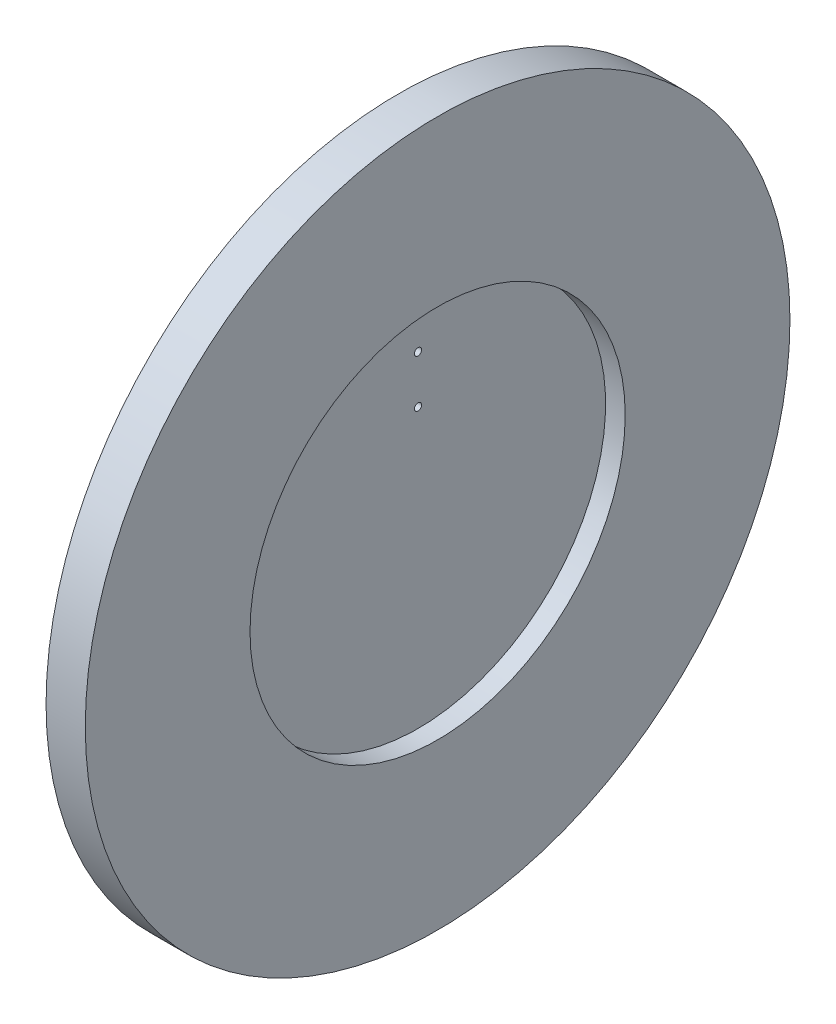
ISO-10303-21;
HEADER;
FILE_DESCRIPTION(('STEP AP214'),'2;1');
FILE_NAME('part.step','',(''),(''),'','','');
FILE_SCHEMA(('AUTOMOTIVE_DESIGN { 1 0 10303 214 1 1 1 1 }'));
ENDSEC;
DATA;
#1=APPLICATION_CONTEXT('core data for automotive mechanical design processes');
#2=APPLICATION_PROTOCOL_DEFINITION('international standard','automotive_design',2000,#1);
#3=PRODUCT_CONTEXT('',#1,'mechanical');
#4=PRODUCT('Part','Part','',(#3));
#5=PRODUCT_RELATED_PRODUCT_CATEGORY('part','',(#4));
#6=PRODUCT_DEFINITION_FORMATION('','',#4);
#7=PRODUCT_DEFINITION_CONTEXT('part definition',#1,'design');
#8=PRODUCT_DEFINITION('design','',#6,#7);
#9=PRODUCT_DEFINITION_SHAPE('','',#8);
#10=(LENGTH_UNIT() NAMED_UNIT(*) SI_UNIT(.MILLI.,.METRE.));
#11=(NAMED_UNIT(*) PLANE_ANGLE_UNIT() SI_UNIT($,.RADIAN.));
#12=(NAMED_UNIT(*) SI_UNIT($,.STERADIAN.) SOLID_ANGLE_UNIT());
#13=UNCERTAINTY_MEASURE_WITH_UNIT(LENGTH_MEASURE(1.E-05),#10,'distance_accuracy_value','');
#14=(GEOMETRIC_REPRESENTATION_CONTEXT(3) GLOBAL_UNCERTAINTY_ASSIGNED_CONTEXT((#13)) GLOBAL_UNIT_ASSIGNED_CONTEXT((#10,
#11,#12)) REPRESENTATION_CONTEXT('',''));
#15=CARTESIAN_POINT('',(0.,0.,0.));
#16=DIRECTION('',(0.,0.,1.));
#17=DIRECTION('',(1.,0.,0.));
#18=AXIS2_PLACEMENT_3D('',#15,#16,#17);
#19=CARTESIAN_POINT('',(10.,0.,0.));
#20=DIRECTION('',(-1.,0.,0.));
#21=DIRECTION('',(0.,0.,1.));
#22=AXIS2_PLACEMENT_3D('',#19,#20,#21);
#23=CYLINDRICAL_SURFACE('',#22,47.825);
#24=CARTESIAN_POINT('',(10.,0.,0.));
#25=DIRECTION('',(1.,0.,0.));
#26=DIRECTION('',(0.,0.,-1.));
#27=AXIS2_PLACEMENT_3D('',#24,#25,#26);
#28=CIRCLE('',#27,47.825);
#29=CARTESIAN_POINT('',(10.,0.,-47.825));
#30=VERTEX_POINT('',#29);
#31=EDGE_CURVE('E61',#30,#30,#28,.T.);
#32=ORIENTED_EDGE('',*,*,#31,.T.);
#33=EDGE_LOOP('',(#32));
#34=FACE_BOUND('',#33,.T.);
#35=CARTESIAN_POINT('',(5.,0.,0.));
#36=DIRECTION('',(-1.,0.,0.));
#37=DIRECTION('',(0.,0.,1.));
#38=AXIS2_PLACEMENT_3D('',#35,#36,#37);
#39=CIRCLE('',#38,47.825);
#40=CARTESIAN_POINT('',(5.,0.,47.825));
#41=VERTEX_POINT('',#40);
#42=EDGE_CURVE('E58',#41,#41,#39,.T.);
#43=ORIENTED_EDGE('',*,*,#42,.T.);
#44=EDGE_LOOP('',(#43));
#45=FACE_BOUND('',#44,.T.);
#46=ADVANCED_FACE('F41',(#34,#45),#23,.F.);
#47=CARTESIAN_POINT('',(10.,0.,0.));
#48=DIRECTION('',(1.,0.,0.));
#49=DIRECTION('',(0.,0.,-1.));
#50=AXIS2_PLACEMENT_3D('',#47,#48,#49);
#51=PLANE('',#50);
#52=CARTESIAN_POINT('',(10.,0.,0.));
#53=DIRECTION('',(1.,0.,0.));
#54=DIRECTION('',(0.,0.,-1.));
#55=AXIS2_PLACEMENT_3D('',#52,#53,#54);
#56=CIRCLE('',#55,89.825);
#57=CARTESIAN_POINT('',(10.,0.,-89.825));
#58=VERTEX_POINT('',#57);
#59=EDGE_CURVE('E49',#58,#58,#56,.T.);
#60=ORIENTED_EDGE('',*,*,#59,.T.);
#61=EDGE_LOOP('',(#60));
#62=FACE_BOUND('',#61,.T.);
#63=ORIENTED_EDGE('',*,*,#31,.F.);
#64=EDGE_LOOP('',(#63));
#65=FACE_BOUND('',#64,.T.);
#66=ADVANCED_FACE('F71',(#62,#65),#51,.T.);
#67=CARTESIAN_POINT('',(0.,0.,0.));
#68=DIRECTION('',(1.,0.,0.));
#69=DIRECTION('',(0.,0.,-1.));
#70=AXIS2_PLACEMENT_3D('',#67,#68,#69);
#71=PLANE('',#70);
#72=CARTESIAN_POINT('',(0.,0.,0.));
#73=DIRECTION('',(-1.,0.,0.));
#74=DIRECTION('',(0.,0.,1.));
#75=AXIS2_PLACEMENT_3D('',#72,#73,#74);
#76=CIRCLE('',#75,47.825);
#77=CARTESIAN_POINT('',(0.,0.,47.825));
#78=VERTEX_POINT('',#77);
#79=EDGE_CURVE('E10',#78,#78,#76,.T.);
#80=ORIENTED_EDGE('',*,*,#79,.F.);
#81=EDGE_LOOP('',(#80));
#82=FACE_BOUND('',#81,.T.);
#83=CARTESIAN_POINT('',(0.,0.,0.));
#84=DIRECTION('',(1.,0.,0.));
#85=DIRECTION('',(0.,0.,-1.));
#86=AXIS2_PLACEMENT_3D('',#83,#84,#85);
#87=CIRCLE('',#86,89.825);
#88=CARTESIAN_POINT('',(0.,0.,-89.825));
#89=VERTEX_POINT('',#88);
#90=EDGE_CURVE('E45',#89,#89,#87,.T.);
#91=ORIENTED_EDGE('',*,*,#90,.F.);
#92=EDGE_LOOP('',(#91));
#93=FACE_BOUND('',#92,.T.);
#94=ADVANCED_FACE('F69',(#82,#93),#71,.F.);
#95=CARTESIAN_POINT('',(10.,0.,0.));
#96=DIRECTION('',(-1.,0.,0.));
#97=DIRECTION('',(0.,0.,1.));
#98=AXIS2_PLACEMENT_3D('',#95,#96,#97);
#99=CYLINDRICAL_SURFACE('',#98,89.825);
#100=ORIENTED_EDGE('',*,*,#59,.F.);
#101=EDGE_LOOP('',(#100));
#102=FACE_BOUND('',#101,.T.);
#103=ORIENTED_EDGE('',*,*,#90,.T.);
#104=EDGE_LOOP('',(#103));
#105=FACE_BOUND('',#104,.T.);
#106=ADVANCED_FACE('F43',(#102,#105),#99,.T.);
#107=CARTESIAN_POINT('',(5.,0.,0.));
#108=DIRECTION('',(-1.,0.,0.));
#109=DIRECTION('',(0.,0.,1.));
#110=AXIS2_PLACEMENT_3D('',#107,#108,#109);
#111=PLANE('',#110);
#112=CARTESIAN_POINT('',(5.,23.1920297355447,0.));
#113=DIRECTION('',(-1.,0.,0.));
#114=DIRECTION('',(0.,0.,1.));
#115=AXIS2_PLACEMENT_3D('',#112,#113,#114);
#116=CIRCLE('',#115,0.914623685000002);
#117=CARTESIAN_POINT('',(5.,23.1920297355447,0.914623685000002));
#118=VERTEX_POINT('',#117);
#119=EDGE_CURVE('E113',#118,#118,#116,.F.);
#120=ORIENTED_EDGE('',*,*,#119,.F.);
#121=EDGE_LOOP('',(#120));
#122=FACE_BOUND('',#121,.T.);
#123=CARTESIAN_POINT('',(5.,35.3731702644553,0.));
#124=DIRECTION('',(-1.,0.,0.));
#125=DIRECTION('',(0.,0.,1.));
#126=AXIS2_PLACEMENT_3D('',#123,#124,#125);
#127=CIRCLE('',#126,0.914623684999991);
#128=CARTESIAN_POINT('',(5.,35.3731702644553,0.914623684999991));
#129=VERTEX_POINT('',#128);
#130=EDGE_CURVE('E119',#129,#129,#127,.F.);
#131=ORIENTED_EDGE('',*,*,#130,.F.);
#132=EDGE_LOOP('',(#131));
#133=FACE_BOUND('',#132,.T.);
#134=ORIENTED_EDGE('',*,*,#42,.F.);
#135=EDGE_LOOP('',(#134));
#136=FACE_BOUND('',#135,.T.);
#137=ADVANCED_FACE('F78',(#122,#133,#136),#111,.F.);
#138=CARTESIAN_POINT('',(-5.,0.,0.));
#139=DIRECTION('',(1.,0.,0.));
#140=DIRECTION('',(0.,0.,-1.));
#141=AXIS2_PLACEMENT_3D('',#138,#139,#140);
#142=CYLINDRICAL_SURFACE('',#141,47.825);
#143=CARTESIAN_POINT('',(-5.,0.,0.));
#144=DIRECTION('',(-1.,0.,0.));
#145=DIRECTION('',(0.,0.,1.));
#146=AXIS2_PLACEMENT_3D('',#143,#144,#145);
#147=CIRCLE('',#146,47.825);
#148=CARTESIAN_POINT('',(-5.,0.,47.825));
#149=VERTEX_POINT('',#148);
#150=EDGE_CURVE('E56',#149,#149,#147,.T.);
#151=ORIENTED_EDGE('',*,*,#150,.F.);
#152=EDGE_LOOP('',(#151));
#153=FACE_BOUND('',#152,.T.);
#154=ORIENTED_EDGE('',*,*,#79,.T.);
#155=EDGE_LOOP('',(#154));
#156=FACE_BOUND('',#155,.T.);
#157=ADVANCED_FACE('F90',(#153,#156),#142,.T.);
#158=CARTESIAN_POINT('',(-5.,0.,0.));
#159=DIRECTION('',(-1.,0.,0.));
#160=DIRECTION('',(0.,0.,1.));
#161=AXIS2_PLACEMENT_3D('',#158,#159,#160);
#162=PLANE('',#161);
#163=CARTESIAN_POINT('',(-5.,23.1920297355447,0.));
#164=DIRECTION('',(-1.,0.,0.));
#165=DIRECTION('',(0.,0.,1.));
#166=AXIS2_PLACEMENT_3D('',#163,#164,#165);
#167=CIRCLE('',#166,0.914623685000002);
#168=CARTESIAN_POINT('',(-5.,23.1920297355447,0.914623685000002));
#169=VERTEX_POINT('',#168);
#170=EDGE_CURVE('E110',#169,#169,#167,.T.);
#171=ORIENTED_EDGE('',*,*,#170,.F.);
#172=EDGE_LOOP('',(#171));
#173=FACE_BOUND('',#172,.T.);
#174=CARTESIAN_POINT('',(-5.,35.3731702644553,0.));
#175=DIRECTION('',(-1.,0.,0.));
#176=DIRECTION('',(0.,0.,-1.));
#177=AXIS2_PLACEMENT_3D('',#174,#175,#176);
#178=CIRCLE('',#177,0.914623684999991);
#179=CARTESIAN_POINT('',(-5.,35.3731702644553,-0.914623684999991));
#180=VERTEX_POINT('',#179);
#181=EDGE_CURVE('E116',#180,#180,#178,.T.);
#182=ORIENTED_EDGE('',*,*,#181,.F.);
#183=EDGE_LOOP('',(#182));
#184=FACE_BOUND('',#183,.T.);
#185=ORIENTED_EDGE('',*,*,#150,.T.);
#186=EDGE_LOOP('',(#185));
#187=FACE_BOUND('',#186,.T.);
#188=ADVANCED_FACE('F93',(#173,#184,#187),#162,.T.);
#189=CARTESIAN_POINT('',(10.001,35.3731702644553,0.));
#190=DIRECTION('',(-1.,0.,0.));
#191=DIRECTION('',(0.,0.,1.));
#192=AXIS2_PLACEMENT_3D('',#189,#190,#191);
#193=CYLINDRICAL_SURFACE('',#192,0.914623684999991);
#194=ORIENTED_EDGE('',*,*,#181,.T.);
#195=EDGE_LOOP('',(#194));
#196=FACE_BOUND('',#195,.T.);
#197=ORIENTED_EDGE('',*,*,#130,.T.);
#198=EDGE_LOOP('',(#197));
#199=FACE_BOUND('',#198,.T.);
#200=ADVANCED_FACE('F97',(#196,#199),#193,.F.);
#201=CARTESIAN_POINT('',(10.001,23.1920297355447,0.));
#202=DIRECTION('',(-1.,0.,0.));
#203=DIRECTION('',(0.,0.,1.));
#204=AXIS2_PLACEMENT_3D('',#201,#202,#203);
#205=CYLINDRICAL_SURFACE('',#204,0.914623685000002);
#206=ORIENTED_EDGE('',*,*,#170,.T.);
#207=EDGE_LOOP('',(#206));
#208=FACE_BOUND('',#207,.T.);
#209=ORIENTED_EDGE('',*,*,#119,.T.);
#210=EDGE_LOOP('',(#209));
#211=FACE_BOUND('',#210,.T.);
#212=ADVANCED_FACE('F101',(#208,#211),#205,.F.);
#213=CLOSED_SHELL('',(#46,#66,#94,#106,#137,#157,#188,#200,#212));
#214=MANIFOLD_SOLID_BREP('B2',#213);
#215=ADVANCED_BREP_SHAPE_REPRESENTATION('',(#18,#214),#14);
#216=SHAPE_DEFINITION_REPRESENTATION(#9,#215);
ENDSEC;
END-ISO-10303-21;
